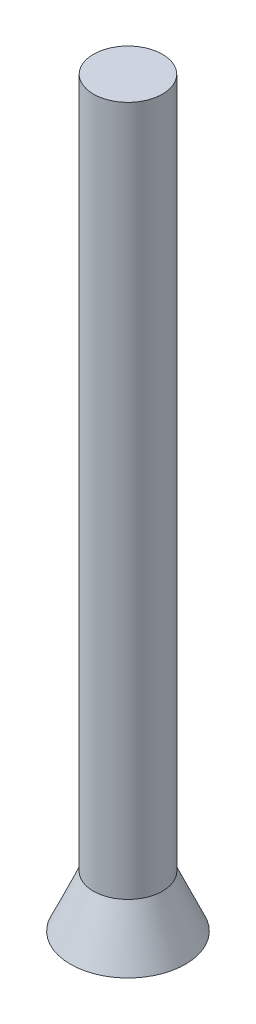
ISO-10303-21;
HEADER;
FILE_DESCRIPTION(('STEP AP214'),'2;1');
FILE_NAME('part.step','',(''),(''),'','','');
FILE_SCHEMA(('AUTOMOTIVE_DESIGN { 1 0 10303 214 1 1 1 1 }'));
ENDSEC;
DATA;
#1=APPLICATION_CONTEXT('core data for automotive mechanical design processes');
#2=APPLICATION_PROTOCOL_DEFINITION('international standard','automotive_design',2000,#1);
#3=PRODUCT_CONTEXT('',#1,'mechanical');
#4=PRODUCT('Part','Part','',(#3));
#5=PRODUCT_RELATED_PRODUCT_CATEGORY('part','',(#4));
#6=PRODUCT_DEFINITION_FORMATION('','',#4);
#7=PRODUCT_DEFINITION_CONTEXT('part definition',#1,'design');
#8=PRODUCT_DEFINITION('design','',#6,#7);
#9=PRODUCT_DEFINITION_SHAPE('','',#8);
#10=(LENGTH_UNIT() NAMED_UNIT(*) SI_UNIT(.MILLI.,.METRE.));
#11=(NAMED_UNIT(*) PLANE_ANGLE_UNIT() SI_UNIT($,.RADIAN.));
#12=(NAMED_UNIT(*) SI_UNIT($,.STERADIAN.) SOLID_ANGLE_UNIT());
#13=UNCERTAINTY_MEASURE_WITH_UNIT(LENGTH_MEASURE(1.E-05),#10,'distance_accuracy_value','');
#14=(GEOMETRIC_REPRESENTATION_CONTEXT(3) GLOBAL_UNCERTAINTY_ASSIGNED_CONTEXT((#13)) GLOBAL_UNIT_ASSIGNED_CONTEXT((#10,
#11,#12)) REPRESENTATION_CONTEXT('',''));
#15=CARTESIAN_POINT('',(0.,0.,0.));
#16=DIRECTION('',(0.,0.,1.));
#17=DIRECTION('',(1.,0.,0.));
#18=AXIS2_PLACEMENT_3D('',#15,#16,#17);
#19=CARTESIAN_POINT('',(0.,0.,0.));
#20=DIRECTION('',(0.,-1.,0.));
#21=DIRECTION('',(0.,0.,1.));
#22=AXIS2_PLACEMENT_3D('',#19,#20,#21);
#23=CONICAL_SURFACE('',#22,2.5,0.41887902047864);
#24=CARTESIAN_POINT('',(0.,2.25,0.));
#25=DIRECTION('',(0.,1.,0.));
#26=DIRECTION('',(0.,0.,1.));
#27=AXIS2_PLACEMENT_3D('',#24,#25,#26);
#28=CIRCLE('',#27,1.5);
#29=CARTESIAN_POINT('',(0.,2.25,1.5));
#30=VERTEX_POINT('',#29);
#31=EDGE_CURVE('E11',#30,#30,#28,.T.);
#32=ORIENTED_EDGE('',*,*,#31,.F.);
#33=EDGE_LOOP('',(#32));
#34=FACE_BOUND('',#33,.T.);
#35=CARTESIAN_POINT('',(0.,0.,0.));
#36=DIRECTION('',(0.,1.,0.));
#37=DIRECTION('',(0.,0.,1.));
#38=AXIS2_PLACEMENT_3D('',#35,#36,#37);
#39=CIRCLE('',#38,2.5);
#40=CARTESIAN_POINT('',(0.,0.,2.5));
#41=VERTEX_POINT('',#40);
#42=EDGE_CURVE('E47',#41,#41,#39,.T.);
#43=ORIENTED_EDGE('',*,*,#42,.T.);
#44=EDGE_LOOP('',(#43));
#45=FACE_BOUND('',#44,.T.);
#46=ADVANCED_FACE('F37',(#34,#45),#23,.T.);
#47=CARTESIAN_POINT('',(0.,0.,0.));
#48=DIRECTION('',(0.,1.,0.));
#49=DIRECTION('',(0.,0.,1.));
#50=AXIS2_PLACEMENT_3D('',#47,#48,#49);
#51=PLANE('',#50);
#52=DIRECTION('',(0.,0.,1.));
#53=VECTOR('',#52,1.);
#54=CARTESIAN_POINT('',(0.5,0.,-0.5));
#55=LINE('',#54,#53);
#56=CARTESIAN_POINT('',(0.5,0.,-2.));
#57=VERTEX_POINT('',#56);
#58=CARTESIAN_POINT('',(0.5,0.,-0.5));
#59=VERTEX_POINT('',#58);
#60=EDGE_CURVE('E146',#57,#59,#55,.T.);
#61=ORIENTED_EDGE('',*,*,#60,.F.);
#62=DIRECTION('',(1.,0.,0.));
#63=VECTOR('',#62,1.);
#64=CARTESIAN_POINT('',(-0.5,0.,-2.));
#65=LINE('',#64,#63);
#66=CARTESIAN_POINT('',(-0.5,0.,-2.));
#67=VERTEX_POINT('',#66);
#68=EDGE_CURVE('E54',#67,#57,#65,.T.);
#69=ORIENTED_EDGE('',*,*,#68,.F.);
#70=DIRECTION('',(0.,0.,-1.));
#71=VECTOR('',#70,1.);
#72=CARTESIAN_POINT('',(-0.5,0.,-0.5));
#73=LINE('',#72,#71);
#74=CARTESIAN_POINT('',(-0.5,0.,-0.5));
#75=VERTEX_POINT('',#74);
#76=EDGE_CURVE('E179',#75,#67,#73,.T.);
#77=ORIENTED_EDGE('',*,*,#76,.F.);
#78=DIRECTION('',(1.,0.,0.));
#79=VECTOR('',#78,1.);
#80=CARTESIAN_POINT('',(-2.,0.,-0.5));
#81=LINE('',#80,#79);
#82=CARTESIAN_POINT('',(-2.,0.,-0.5));
#83=VERTEX_POINT('',#82);
#84=EDGE_CURVE('E177',#83,#75,#81,.T.);
#85=ORIENTED_EDGE('',*,*,#84,.F.);
#86=DIRECTION('',(0.,0.,-1.));
#87=VECTOR('',#86,1.);
#88=CARTESIAN_POINT('',(-2.,0.,0.5));
#89=LINE('',#88,#87);
#90=CARTESIAN_POINT('',(-2.,0.,0.5));
#91=VERTEX_POINT('',#90);
#92=EDGE_CURVE('E174',#91,#83,#89,.T.);
#93=ORIENTED_EDGE('',*,*,#92,.F.);
#94=DIRECTION('',(-1.,0.,0.));
#95=VECTOR('',#94,1.);
#96=CARTESIAN_POINT('',(-2.,0.,0.5));
#97=LINE('',#96,#95);
#98=CARTESIAN_POINT('',(-0.5,0.,0.5));
#99=VERTEX_POINT('',#98);
#100=EDGE_CURVE('E171',#99,#91,#97,.T.);
#101=ORIENTED_EDGE('',*,*,#100,.F.);
#102=DIRECTION('',(0.,0.,-1.));
#103=VECTOR('',#102,1.);
#104=CARTESIAN_POINT('',(-0.5,0.,2.));
#105=LINE('',#104,#103);
#106=CARTESIAN_POINT('',(-0.5,0.,2.));
#107=VERTEX_POINT('',#106);
#108=EDGE_CURVE('E168',#107,#99,#105,.T.);
#109=ORIENTED_EDGE('',*,*,#108,.F.);
#110=DIRECTION('',(-1.,0.,0.));
#111=VECTOR('',#110,1.);
#112=CARTESIAN_POINT('',(-0.5,0.,2.));
#113=LINE('',#112,#111);
#114=CARTESIAN_POINT('',(0.5,0.,2.));
#115=VERTEX_POINT('',#114);
#116=EDGE_CURVE('E165',#115,#107,#113,.T.);
#117=ORIENTED_EDGE('',*,*,#116,.F.);
#118=DIRECTION('',(0.,0.,1.));
#119=VECTOR('',#118,1.);
#120=CARTESIAN_POINT('',(0.5,0.,2.));
#121=LINE('',#120,#119);
#122=CARTESIAN_POINT('',(0.5,0.,0.5));
#123=VERTEX_POINT('',#122);
#124=EDGE_CURVE('E162',#123,#115,#121,.T.);
#125=ORIENTED_EDGE('',*,*,#124,.F.);
#126=DIRECTION('',(-1.,0.,0.));
#127=VECTOR('',#126,1.);
#128=CARTESIAN_POINT('',(0.5,0.,0.5));
#129=LINE('',#128,#127);
#130=CARTESIAN_POINT('',(2.,0.,0.5));
#131=VERTEX_POINT('',#130);
#132=EDGE_CURVE('E156',#131,#123,#129,.T.);
#133=ORIENTED_EDGE('',*,*,#132,.F.);
#134=DIRECTION('',(0.,0.,1.));
#135=VECTOR('',#134,1.);
#136=CARTESIAN_POINT('',(2.,0.,0.5));
#137=LINE('',#136,#135);
#138=CARTESIAN_POINT('',(2.,0.,-0.5));
#139=VERTEX_POINT('',#138);
#140=EDGE_CURVE('E154',#139,#131,#137,.T.);
#141=ORIENTED_EDGE('',*,*,#140,.F.);
#142=DIRECTION('',(1.,0.,0.));
#143=VECTOR('',#142,1.);
#144=CARTESIAN_POINT('',(0.5,0.,-0.5));
#145=LINE('',#144,#143);
#146=EDGE_CURVE('E137',#59,#139,#145,.T.);
#147=ORIENTED_EDGE('',*,*,#146,.F.);
#148=EDGE_LOOP('',(#61,#69,#77,#85,#93,#101,#109,#117,#125,#133,#141,#147));
#149=FACE_BOUND('',#148,.T.);
#150=ORIENTED_EDGE('',*,*,#42,.F.);
#151=EDGE_LOOP('',(#150));
#152=FACE_BOUND('',#151,.T.);
#153=ADVANCED_FACE('F150',(#149,#152),#51,.F.);
#154=CARTESIAN_POINT('',(0.,32.25,0.));
#155=DIRECTION('',(0.,-1.,0.));
#156=DIRECTION('',(0.,0.,-1.));
#157=AXIS2_PLACEMENT_3D('',#154,#155,#156);
#158=CYLINDRICAL_SURFACE('',#157,1.5);
#159=CARTESIAN_POINT('',(0.,32.25,0.));
#160=DIRECTION('',(0.,1.,0.));
#161=DIRECTION('',(0.,0.,1.));
#162=AXIS2_PLACEMENT_3D('',#159,#160,#161);
#163=CIRCLE('',#162,1.5);
#164=CARTESIAN_POINT('',(0.,32.25,1.5));
#165=VERTEX_POINT('',#164);
#166=EDGE_CURVE('E183',#165,#165,#163,.T.);
#167=ORIENTED_EDGE('',*,*,#166,.F.);
#168=EDGE_LOOP('',(#167));
#169=FACE_BOUND('',#168,.T.);
#170=ORIENTED_EDGE('',*,*,#31,.T.);
#171=EDGE_LOOP('',(#170));
#172=FACE_BOUND('',#171,.T.);
#173=ADVANCED_FACE('F242',(#169,#172),#158,.T.);
#174=CARTESIAN_POINT('',(0.,32.25,0.));
#175=DIRECTION('',(0.,1.,0.));
#176=DIRECTION('',(0.,0.,1.));
#177=AXIS2_PLACEMENT_3D('',#174,#175,#176);
#178=PLANE('',#177);
#179=ORIENTED_EDGE('',*,*,#166,.T.);
#180=EDGE_LOOP('',(#179));
#181=FACE_BOUND('',#180,.T.);
#182=ADVANCED_FACE('F251',(#181),#178,.T.);
#183=CARTESIAN_POINT('',(-0.5,0.,-2.));
#184=DIRECTION('',(0.,0.284015344703923,-0.958819734868193));
#185=DIRECTION('',(0.,0.958819734868193,0.284015344703923));
#186=AXIS2_PLACEMENT_3D('',#183,#184,#185);
#187=PLANE('',#186);
#188=ORIENTED_EDGE('',*,*,#68,.T.);
#189=DIRECTION('',(0.273209828505095,-0.922340923529056,-0.273209828505095));
#190=VECTOR('',#189,1.);
#191=CARTESIAN_POINT('',(0.425356389608217,0.251992605540605,-1.92535638960822));
#192=LINE('',#191,#190);
#193=CARTESIAN_POINT('',(0.0556797575568785,1.5,-1.55567975755688));
#194=VERTEX_POINT('',#193);
#195=EDGE_CURVE('E97',#194,#57,#192,.T.);
#196=ORIENTED_EDGE('',*,*,#195,.F.);
#197=DIRECTION('',(1.,0.,0.));
#198=VECTOR('',#197,1.);
#199=CARTESIAN_POINT('',(-0.5,1.5,-1.55567975755688));
#200=LINE('',#199,#198);
#201=CARTESIAN_POINT('',(-0.0556797575568784,1.5,-1.55567975755688));
#202=VERTEX_POINT('',#201);
#203=EDGE_CURVE('E181',#202,#194,#200,.T.);
#204=ORIENTED_EDGE('',*,*,#203,.F.);
#205=DIRECTION('',(-0.273209828505095,-0.922340923529056,-0.273209828505095));
#206=VECTOR('',#205,1.);
#207=CARTESIAN_POINT('',(-0.388034584412325,0.377988908310907,-1.88803458441232));
#208=LINE('',#207,#206);
#209=EDGE_CURVE('E62',#202,#67,#208,.T.);
#210=ORIENTED_EDGE('',*,*,#209,.T.);
#211=EDGE_LOOP('',(#188,#196,#204,#210));
#212=FACE_BOUND('',#211,.T.);
#213=ADVANCED_FACE('F280',(#212),#187,.F.);
#214=CARTESIAN_POINT('',(-0.5,0.,-0.5));
#215=DIRECTION('',(-0.958819734868193,0.284015344703923,0.));
#216=DIRECTION('',(-0.284015344703923,-0.958819734868193,0.));
#217=AXIS2_PLACEMENT_3D('',#214,#215,#216);
#218=PLANE('',#217);
#219=ORIENTED_EDGE('',*,*,#76,.T.);
#220=ORIENTED_EDGE('',*,*,#209,.F.);
#221=DIRECTION('',(0.,0.,-1.));
#222=VECTOR('',#221,1.);
#223=CARTESIAN_POINT('',(-0.0556797575568785,1.5,-0.5));
#224=LINE('',#223,#222);
#225=CARTESIAN_POINT('',(-0.0556797575568785,1.5,-0.0556797575568784));
#226=VERTEX_POINT('',#225);
#227=EDGE_CURVE('E184',#226,#202,#224,.T.);
#228=ORIENTED_EDGE('',*,*,#227,.F.);
#229=DIRECTION('',(-0.273209828505095,-0.922340923529056,-0.273209828505095));
#230=VECTOR('',#229,1.);
#231=CARTESIAN_POINT('',(-0.5,0.,-0.5));
#232=LINE('',#231,#230);
#233=EDGE_CURVE('E102',#226,#75,#232,.T.);
#234=ORIENTED_EDGE('',*,*,#233,.T.);
#235=EDGE_LOOP('',(#219,#220,#228,#234));
#236=FACE_BOUND('',#235,.T.);
#237=ADVANCED_FACE('F293',(#236),#218,.F.);
#238=CARTESIAN_POINT('',(-2.,0.,-0.5));
#239=DIRECTION('',(0.,0.284015344703923,-0.958819734868193));
#240=DIRECTION('',(0.,0.958819734868193,0.284015344703923));
#241=AXIS2_PLACEMENT_3D('',#238,#239,#240);
#242=PLANE('',#241);
#243=ORIENTED_EDGE('',*,*,#84,.T.);
#244=ORIENTED_EDGE('',*,*,#233,.F.);
#245=DIRECTION('',(1.,0.,0.));
#246=VECTOR('',#245,1.);
#247=CARTESIAN_POINT('',(-2.,1.5,-0.0556797575568787));
#248=LINE('',#247,#246);
#249=CARTESIAN_POINT('',(-1.55567975755688,1.5,-0.0556797575568787));
#250=VERTEX_POINT('',#249);
#251=EDGE_CURVE('E207',#250,#226,#248,.T.);
#252=ORIENTED_EDGE('',*,*,#251,.F.);
#253=DIRECTION('',(-0.273209828505095,-0.922340923529056,-0.273209828505095));
#254=VECTOR('',#253,1.);
#255=CARTESIAN_POINT('',(-1.92535638960822,0.251992605540605,-0.425356389608217));
#256=LINE('',#255,#254);
#257=EDGE_CURVE('E199',#250,#83,#256,.T.);
#258=ORIENTED_EDGE('',*,*,#257,.T.);
#259=EDGE_LOOP('',(#243,#244,#252,#258));
#260=FACE_BOUND('',#259,.T.);
#261=ADVANCED_FACE('F302',(#260),#242,.F.);
#262=CARTESIAN_POINT('',(-2.,0.,0.5));
#263=DIRECTION('',(-0.958819734868193,0.284015344703923,0.));
#264=DIRECTION('',(-0.284015344703923,-0.958819734868193,0.));
#265=AXIS2_PLACEMENT_3D('',#262,#263,#264);
#266=PLANE('',#265);
#267=ORIENTED_EDGE('',*,*,#92,.T.);
#268=ORIENTED_EDGE('',*,*,#257,.F.);
#269=DIRECTION('',(0.,0.,-1.));
#270=VECTOR('',#269,1.);
#271=CARTESIAN_POINT('',(-1.55567975755688,1.5,0.5));
#272=LINE('',#271,#270);
#273=CARTESIAN_POINT('',(-1.55567975755688,1.5,0.0556797575568783));
#274=VERTEX_POINT('',#273);
#275=EDGE_CURVE('E210',#274,#250,#272,.T.);
#276=ORIENTED_EDGE('',*,*,#275,.F.);
#277=DIRECTION('',(-0.273209828505095,-0.922340923529056,0.273209828505095));
#278=VECTOR('',#277,1.);
#279=CARTESIAN_POINT('',(-2.,0.,0.5));
#280=LINE('',#279,#278);
#281=EDGE_CURVE('E197',#274,#91,#280,.T.);
#282=ORIENTED_EDGE('',*,*,#281,.T.);
#283=EDGE_LOOP('',(#267,#268,#276,#282));
#284=FACE_BOUND('',#283,.T.);
#285=ADVANCED_FACE('F310',(#284),#266,.F.);
#286=CARTESIAN_POINT('',(-2.,0.,0.5));
#287=DIRECTION('',(0.,0.284015344703923,0.958819734868193));
#288=DIRECTION('',(0.,-0.958819734868193,0.284015344703923));
#289=AXIS2_PLACEMENT_3D('',#286,#287,#288);
#290=PLANE('',#289);
#291=ORIENTED_EDGE('',*,*,#100,.T.);
#292=ORIENTED_EDGE('',*,*,#281,.F.);
#293=DIRECTION('',(-1.,0.,0.));
#294=VECTOR('',#293,1.);
#295=CARTESIAN_POINT('',(-2.,1.5,0.0556797575568783));
#296=LINE('',#295,#294);
#297=CARTESIAN_POINT('',(-0.0556797575568785,1.5,0.0556797575568785));
#298=VERTEX_POINT('',#297);
#299=EDGE_CURVE('E213',#298,#274,#296,.T.);
#300=ORIENTED_EDGE('',*,*,#299,.F.);
#301=DIRECTION('',(-0.273209828505095,-0.922340923529056,0.273209828505095));
#302=VECTOR('',#301,1.);
#303=CARTESIAN_POINT('',(-0.611965415587675,-0.377988908310907,0.611965415587675));
#304=LINE('',#303,#302);
#305=EDGE_CURVE('E195',#298,#99,#304,.T.);
#306=ORIENTED_EDGE('',*,*,#305,.T.);
#307=EDGE_LOOP('',(#291,#292,#300,#306));
#308=FACE_BOUND('',#307,.T.);
#309=ADVANCED_FACE('F320',(#308),#290,.F.);
#310=CARTESIAN_POINT('',(-0.5,0.,2.));
#311=DIRECTION('',(-0.958819734868193,0.284015344703923,0.));
#312=DIRECTION('',(-0.284015344703923,-0.958819734868193,0.));
#313=AXIS2_PLACEMENT_3D('',#310,#311,#312);
#314=PLANE('',#313);
#315=ORIENTED_EDGE('',*,*,#108,.T.);
#316=ORIENTED_EDGE('',*,*,#305,.F.);
#317=DIRECTION('',(0.,0.,-1.));
#318=VECTOR('',#317,1.);
#319=CARTESIAN_POINT('',(-0.0556797575568784,1.5,2.));
#320=LINE('',#319,#318);
#321=CARTESIAN_POINT('',(-0.0556797575568784,1.5,1.55567975755688));
#322=VERTEX_POINT('',#321);
#323=EDGE_CURVE('E216',#322,#298,#320,.T.);
#324=ORIENTED_EDGE('',*,*,#323,.F.);
#325=DIRECTION('',(-0.273209828505095,-0.922340923529056,0.273209828505095));
#326=VECTOR('',#325,1.);
#327=CARTESIAN_POINT('',(-0.5,0.,2.));
#328=LINE('',#327,#326);
#329=EDGE_CURVE('E193',#322,#107,#328,.T.);
#330=ORIENTED_EDGE('',*,*,#329,.T.);
#331=EDGE_LOOP('',(#315,#316,#324,#330));
#332=FACE_BOUND('',#331,.T.);
#333=ADVANCED_FACE('F330',(#332),#314,.F.);
#334=CARTESIAN_POINT('',(-0.5,0.,2.));
#335=DIRECTION('',(0.,0.284015344703923,0.958819734868193));
#336=DIRECTION('',(0.,-0.958819734868193,0.284015344703923));
#337=AXIS2_PLACEMENT_3D('',#334,#335,#336);
#338=PLANE('',#337);
#339=ORIENTED_EDGE('',*,*,#116,.T.);
#340=ORIENTED_EDGE('',*,*,#329,.F.);
#341=DIRECTION('',(-1.,0.,0.));
#342=VECTOR('',#341,1.);
#343=CARTESIAN_POINT('',(-0.5,1.5,1.55567975755688));
#344=LINE('',#343,#342);
#345=CARTESIAN_POINT('',(0.0556797575568785,1.5,1.55567975755688));
#346=VERTEX_POINT('',#345);
#347=EDGE_CURVE('E219',#346,#322,#344,.T.);
#348=ORIENTED_EDGE('',*,*,#347,.F.);
#349=DIRECTION('',(0.273209828505095,-0.922340923529056,0.273209828505095));
#350=VECTOR('',#349,1.);
#351=CARTESIAN_POINT('',(0.5,0.,2.));
#352=LINE('',#351,#350);
#353=EDGE_CURVE('E191',#346,#115,#352,.T.);
#354=ORIENTED_EDGE('',*,*,#353,.T.);
#355=EDGE_LOOP('',(#339,#340,#348,#354));
#356=FACE_BOUND('',#355,.T.);
#357=ADVANCED_FACE('F340',(#356),#338,.F.);
#358=CARTESIAN_POINT('',(0.5,0.,2.));
#359=DIRECTION('',(0.958819734868193,0.284015344703923,0.));
#360=DIRECTION('',(-0.284015344703923,0.958819734868193,0.));
#361=AXIS2_PLACEMENT_3D('',#358,#359,#360);
#362=PLANE('',#361);
#363=ORIENTED_EDGE('',*,*,#124,.T.);
#364=ORIENTED_EDGE('',*,*,#353,.F.);
#365=DIRECTION('',(0.,0.,1.));
#366=VECTOR('',#365,1.);
#367=CARTESIAN_POINT('',(0.0556797575568786,1.5,2.));
#368=LINE('',#367,#366);
#369=CARTESIAN_POINT('',(0.0556797575568782,1.5,0.0556797575568784));
#370=VERTEX_POINT('',#369);
#371=EDGE_CURVE('E222',#370,#346,#368,.T.);
#372=ORIENTED_EDGE('',*,*,#371,.F.);
#373=DIRECTION('',(0.273209828505095,-0.922340923529057,0.273209828505095));
#374=VECTOR('',#373,1.);
#375=CARTESIAN_POINT('',(0.611965415587675,-0.377988908310907,0.611965415587676));
#376=LINE('',#375,#374);
#377=EDGE_CURVE('E189',#370,#123,#376,.T.);
#378=ORIENTED_EDGE('',*,*,#377,.T.);
#379=EDGE_LOOP('',(#363,#364,#372,#378));
#380=FACE_BOUND('',#379,.T.);
#381=ADVANCED_FACE('F350',(#380),#362,.F.);
#382=CARTESIAN_POINT('',(0.5,0.,0.5));
#383=DIRECTION('',(0.,0.284015344703923,0.958819734868193));
#384=DIRECTION('',(0.,-0.958819734868193,0.284015344703923));
#385=AXIS2_PLACEMENT_3D('',#382,#383,#384);
#386=PLANE('',#385);
#387=ORIENTED_EDGE('',*,*,#132,.T.);
#388=ORIENTED_EDGE('',*,*,#377,.F.);
#389=DIRECTION('',(-1.,0.,0.));
#390=VECTOR('',#389,1.);
#391=CARTESIAN_POINT('',(0.5,1.5,0.0556797575568784));
#392=LINE('',#391,#390);
#393=CARTESIAN_POINT('',(1.55567975755688,1.5,0.0556797575568786));
#394=VERTEX_POINT('',#393);
#395=EDGE_CURVE('E225',#394,#370,#392,.T.);
#396=ORIENTED_EDGE('',*,*,#395,.F.);
#397=DIRECTION('',(0.273209828505095,-0.922340923529057,0.273209828505095));
#398=VECTOR('',#397,1.);
#399=CARTESIAN_POINT('',(2.,0.,0.5));
#400=LINE('',#399,#398);
#401=EDGE_CURVE('E187',#394,#131,#400,.T.);
#402=ORIENTED_EDGE('',*,*,#401,.T.);
#403=EDGE_LOOP('',(#387,#388,#396,#402));
#404=FACE_BOUND('',#403,.T.);
#405=ADVANCED_FACE('F360',(#404),#386,.F.);
#406=CARTESIAN_POINT('',(2.,0.,0.5));
#407=DIRECTION('',(0.958819734868193,0.284015344703923,0.));
#408=DIRECTION('',(-0.284015344703923,0.958819734868193,0.));
#409=AXIS2_PLACEMENT_3D('',#406,#407,#408);
#410=PLANE('',#409);
#411=ORIENTED_EDGE('',*,*,#140,.T.);
#412=ORIENTED_EDGE('',*,*,#401,.F.);
#413=DIRECTION('',(0.,0.,1.));
#414=VECTOR('',#413,1.);
#415=CARTESIAN_POINT('',(1.55567975755688,1.5,0.5));
#416=LINE('',#415,#414);
#417=CARTESIAN_POINT('',(1.55567975755688,1.5,-0.0556797575568783));
#418=VERTEX_POINT('',#417);
#419=EDGE_CURVE('E228',#418,#394,#416,.T.);
#420=ORIENTED_EDGE('',*,*,#419,.F.);
#421=DIRECTION('',(0.273209828505095,-0.922340923529056,-0.273209828505095));
#422=VECTOR('',#421,1.);
#423=CARTESIAN_POINT('',(1.88803458441232,0.377988908310907,-0.388034584412324));
#424=LINE('',#423,#422);
#425=EDGE_CURVE('E143',#418,#139,#424,.T.);
#426=ORIENTED_EDGE('',*,*,#425,.T.);
#427=EDGE_LOOP('',(#411,#412,#420,#426));
#428=FACE_BOUND('',#427,.T.);
#429=ADVANCED_FACE('F370',(#428),#410,.F.);
#430=CARTESIAN_POINT('',(0.5,0.,-0.5));
#431=DIRECTION('',(0.,0.284015344703923,-0.958819734868193));
#432=DIRECTION('',(0.,0.958819734868193,0.284015344703923));
#433=AXIS2_PLACEMENT_3D('',#430,#431,#432);
#434=PLANE('',#433);
#435=ORIENTED_EDGE('',*,*,#146,.T.);
#436=ORIENTED_EDGE('',*,*,#425,.F.);
#437=DIRECTION('',(1.,0.,0.));
#438=VECTOR('',#437,1.);
#439=CARTESIAN_POINT('',(0.5,1.5,-0.0556797575568785));
#440=LINE('',#439,#438);
#441=CARTESIAN_POINT('',(0.0556797575568784,1.5,-0.0556797575568785));
#442=VERTEX_POINT('',#441);
#443=EDGE_CURVE('E140',#442,#418,#440,.T.);
#444=ORIENTED_EDGE('',*,*,#443,.F.);
#445=DIRECTION('',(0.273209828505095,-0.922340923529056,-0.273209828505095));
#446=VECTOR('',#445,1.);
#447=CARTESIAN_POINT('',(0.5,0.,-0.5));
#448=LINE('',#447,#446);
#449=EDGE_CURVE('E133',#442,#59,#448,.T.);
#450=ORIENTED_EDGE('',*,*,#449,.T.);
#451=EDGE_LOOP('',(#435,#436,#444,#450));
#452=FACE_BOUND('',#451,.T.);
#453=ADVANCED_FACE('F135',(#452),#434,.F.);
#454=CARTESIAN_POINT('',(0.5,0.,-0.5));
#455=DIRECTION('',(0.958819734868193,0.284015344703923,0.));
#456=DIRECTION('',(-0.284015344703923,0.958819734868193,0.));
#457=AXIS2_PLACEMENT_3D('',#454,#455,#456);
#458=PLANE('',#457);
#459=ORIENTED_EDGE('',*,*,#60,.T.);
#460=ORIENTED_EDGE('',*,*,#449,.F.);
#461=DIRECTION('',(0.,0.,1.));
#462=VECTOR('',#461,1.);
#463=CARTESIAN_POINT('',(0.0556797575568785,1.5,-0.5));
#464=LINE('',#463,#462);
#465=EDGE_CURVE('E204',#194,#442,#464,.T.);
#466=ORIENTED_EDGE('',*,*,#465,.F.);
#467=ORIENTED_EDGE('',*,*,#195,.T.);
#468=EDGE_LOOP('',(#459,#460,#466,#467));
#469=FACE_BOUND('',#468,.T.);
#470=ADVANCED_FACE('F147',(#469),#458,.F.);
#471=CARTESIAN_POINT('',(0.,1.5,0.));
#472=DIRECTION('',(0.,1.,0.));
#473=DIRECTION('',(0.,0.,1.));
#474=AXIS2_PLACEMENT_3D('',#471,#472,#473);
#475=PLANE('',#474);
#476=ORIENTED_EDGE('',*,*,#203,.T.);
#477=ORIENTED_EDGE('',*,*,#465,.T.);
#478=ORIENTED_EDGE('',*,*,#443,.T.);
#479=ORIENTED_EDGE('',*,*,#419,.T.);
#480=ORIENTED_EDGE('',*,*,#395,.T.);
#481=ORIENTED_EDGE('',*,*,#371,.T.);
#482=ORIENTED_EDGE('',*,*,#347,.T.);
#483=ORIENTED_EDGE('',*,*,#323,.T.);
#484=ORIENTED_EDGE('',*,*,#299,.T.);
#485=ORIENTED_EDGE('',*,*,#275,.T.);
#486=ORIENTED_EDGE('',*,*,#251,.T.);
#487=ORIENTED_EDGE('',*,*,#227,.T.);
#488=EDGE_LOOP('',(#476,#477,#478,#479,#480,#481,#482,#483,#484,#485,#486,#487));
#489=FACE_BOUND('',#488,.T.);
#490=ADVANCED_FACE('F397',(#489),#475,.F.);
#491=CLOSED_SHELL('',(#46,#153,#173,#182,#213,#237,#261,#285,#309,#333,#357,#381,#405,#429,#453,
#470,#490));
#492=MANIFOLD_SOLID_BREP('B2',#491);
#493=ADVANCED_BREP_SHAPE_REPRESENTATION('',(#18,#492),#14);
#494=SHAPE_DEFINITION_REPRESENTATION(#9,#493);
ENDSEC;
END-ISO-10303-21;
